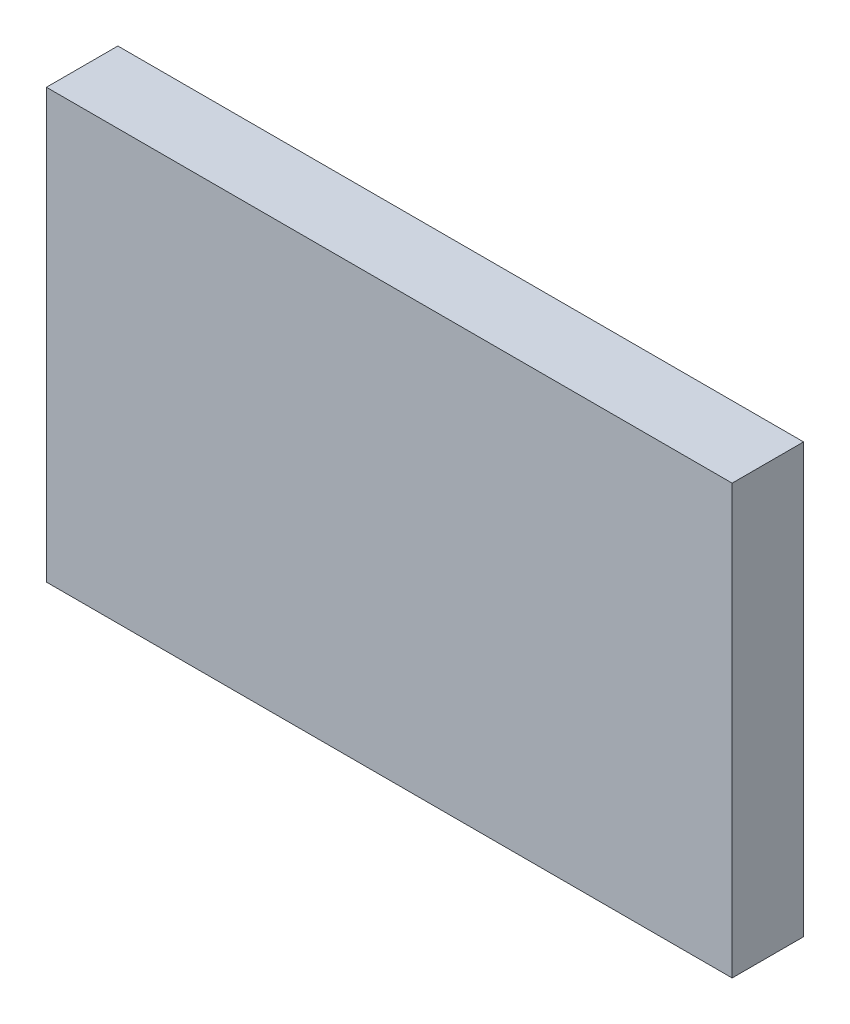
ISO-10303-21;
HEADER;
FILE_DESCRIPTION(('STEP AP214'),'2;1');
FILE_NAME('part.step','',(''),(''),'','','');
FILE_SCHEMA(('AUTOMOTIVE_DESIGN { 1 0 10303 214 1 1 1 1 }'));
ENDSEC;
DATA;
#1=APPLICATION_CONTEXT('core data for automotive mechanical design processes');
#2=APPLICATION_PROTOCOL_DEFINITION('international standard','automotive_design',2000,#1);
#3=PRODUCT_CONTEXT('',#1,'mechanical');
#4=PRODUCT('Part','Part','',(#3));
#5=PRODUCT_RELATED_PRODUCT_CATEGORY('part','',(#4));
#6=PRODUCT_DEFINITION_FORMATION('','',#4);
#7=PRODUCT_DEFINITION_CONTEXT('part definition',#1,'design');
#8=PRODUCT_DEFINITION('design','',#6,#7);
#9=PRODUCT_DEFINITION_SHAPE('','',#8);
#10=(LENGTH_UNIT() NAMED_UNIT(*) SI_UNIT(.MILLI.,.METRE.));
#11=(NAMED_UNIT(*) PLANE_ANGLE_UNIT() SI_UNIT($,.RADIAN.));
#12=(NAMED_UNIT(*) SI_UNIT($,.STERADIAN.) SOLID_ANGLE_UNIT());
#13=UNCERTAINTY_MEASURE_WITH_UNIT(LENGTH_MEASURE(1.E-05),#10,'distance_accuracy_value','');
#14=(GEOMETRIC_REPRESENTATION_CONTEXT(3) GLOBAL_UNCERTAINTY_ASSIGNED_CONTEXT((#13)) GLOBAL_UNIT_ASSIGNED_CONTEXT((#10,
#11,#12)) REPRESENTATION_CONTEXT('',''));
#15=CARTESIAN_POINT('',(0.,0.,0.));
#16=DIRECTION('',(0.,0.,1.));
#17=DIRECTION('',(1.,0.,0.));
#18=AXIS2_PLACEMENT_3D('',#15,#16,#17);
#19=CARTESIAN_POINT('',(24.,15.,5.));
#20=DIRECTION('',(-1.,0.,0.));
#21=DIRECTION('',(0.,-1.,0.));
#22=AXIS2_PLACEMENT_3D('',#19,#20,#21);
#23=PLANE('',#22);
#24=DIRECTION('',(0.,1.,0.));
#25=VECTOR('',#24,1.);
#26=CARTESIAN_POINT('',(24.,15.,0.));
#27=LINE('',#26,#25);
#28=CARTESIAN_POINT('',(24.,-15.,0.));
#29=VERTEX_POINT('',#28);
#30=CARTESIAN_POINT('',(24.,15.,0.));
#31=VERTEX_POINT('',#30);
#32=EDGE_CURVE('E95',#29,#31,#27,.T.);
#33=ORIENTED_EDGE('',*,*,#32,.T.);
#34=DIRECTION('',(0.,0.,-1.));
#35=VECTOR('',#34,1.);
#36=CARTESIAN_POINT('',(24.,15.,5.));
#37=LINE('',#36,#35);
#38=CARTESIAN_POINT('',(24.,15.,5.));
#39=VERTEX_POINT('',#38);
#40=EDGE_CURVE('E11',#39,#31,#37,.T.);
#41=ORIENTED_EDGE('',*,*,#40,.F.);
#42=DIRECTION('',(0.,1.,0.));
#43=VECTOR('',#42,1.);
#44=CARTESIAN_POINT('',(24.,15.,5.));
#45=LINE('',#44,#43);
#46=CARTESIAN_POINT('',(24.,-15.,5.));
#47=VERTEX_POINT('',#46);
#48=EDGE_CURVE('E83',#47,#39,#45,.T.);
#49=ORIENTED_EDGE('',*,*,#48,.F.);
#50=DIRECTION('',(0.,0.,-1.));
#51=VECTOR('',#50,1.);
#52=CARTESIAN_POINT('',(24.,-15.,5.));
#53=LINE('',#52,#51);
#54=EDGE_CURVE('E91',#47,#29,#53,.T.);
#55=ORIENTED_EDGE('',*,*,#54,.T.);
#56=EDGE_LOOP('',(#33,#41,#49,#55));
#57=FACE_BOUND('',#56,.T.);
#58=ADVANCED_FACE('F32',(#57),#23,.F.);
#59=CARTESIAN_POINT('',(-24.,15.,5.));
#60=DIRECTION('',(0.,-1.,0.));
#61=DIRECTION('',(0.,0.,-1.));
#62=AXIS2_PLACEMENT_3D('',#59,#60,#61);
#63=PLANE('',#62);
#64=DIRECTION('',(-1.,0.,0.));
#65=VECTOR('',#64,1.);
#66=CARTESIAN_POINT('',(-24.,15.,0.));
#67=LINE('',#66,#65);
#68=CARTESIAN_POINT('',(-24.,15.,0.));
#69=VERTEX_POINT('',#68);
#70=EDGE_CURVE('E87',#31,#69,#67,.T.);
#71=ORIENTED_EDGE('',*,*,#70,.T.);
#72=DIRECTION('',(0.,0.,-1.));
#73=VECTOR('',#72,1.);
#74=CARTESIAN_POINT('',(-24.,15.,5.));
#75=LINE('',#74,#73);
#76=CARTESIAN_POINT('',(-24.,15.,5.));
#77=VERTEX_POINT('',#76);
#78=EDGE_CURVE('E40',#77,#69,#75,.T.);
#79=ORIENTED_EDGE('',*,*,#78,.F.);
#80=DIRECTION('',(-1.,0.,0.));
#81=VECTOR('',#80,1.);
#82=CARTESIAN_POINT('',(-24.,15.,5.));
#83=LINE('',#82,#81);
#84=EDGE_CURVE('E78',#39,#77,#83,.T.);
#85=ORIENTED_EDGE('',*,*,#84,.F.);
#86=ORIENTED_EDGE('',*,*,#40,.T.);
#87=EDGE_LOOP('',(#71,#79,#85,#86));
#88=FACE_BOUND('',#87,.T.);
#89=ADVANCED_FACE('F86',(#88),#63,.F.);
#90=CARTESIAN_POINT('',(-24.,15.,5.));
#91=DIRECTION('',(1.,0.,0.));
#92=DIRECTION('',(0.,1.,0.));
#93=AXIS2_PLACEMENT_3D('',#90,#91,#92);
#94=PLANE('',#93);
#95=DIRECTION('',(0.,-1.,0.));
#96=VECTOR('',#95,1.);
#97=CARTESIAN_POINT('',(-24.,15.,0.));
#98=LINE('',#97,#96);
#99=CARTESIAN_POINT('',(-24.,-15.,0.));
#100=VERTEX_POINT('',#99);
#101=EDGE_CURVE('E65',#69,#100,#98,.T.);
#102=ORIENTED_EDGE('',*,*,#101,.T.);
#103=DIRECTION('',(0.,0.,-1.));
#104=VECTOR('',#103,1.);
#105=CARTESIAN_POINT('',(-24.,-15.,5.));
#106=LINE('',#105,#104);
#107=CARTESIAN_POINT('',(-24.,-15.,5.));
#108=VERTEX_POINT('',#107);
#109=EDGE_CURVE('E88',#108,#100,#106,.T.);
#110=ORIENTED_EDGE('',*,*,#109,.F.);
#111=DIRECTION('',(0.,-1.,0.));
#112=VECTOR('',#111,1.);
#113=CARTESIAN_POINT('',(-24.,15.,5.));
#114=LINE('',#113,#112);
#115=EDGE_CURVE('E81',#77,#108,#114,.T.);
#116=ORIENTED_EDGE('',*,*,#115,.F.);
#117=ORIENTED_EDGE('',*,*,#78,.T.);
#118=EDGE_LOOP('',(#102,#110,#116,#117));
#119=FACE_BOUND('',#118,.T.);
#120=ADVANCED_FACE('F89',(#119),#94,.F.);
#121=CARTESIAN_POINT('',(-24.,-15.,5.));
#122=DIRECTION('',(0.,1.,0.));
#123=DIRECTION('',(0.,0.,1.));
#124=AXIS2_PLACEMENT_3D('',#121,#122,#123);
#125=PLANE('',#124);
#126=DIRECTION('',(1.,0.,0.));
#127=VECTOR('',#126,1.);
#128=CARTESIAN_POINT('',(-24.,-15.,0.));
#129=LINE('',#128,#127);
#130=EDGE_CURVE('E71',#100,#29,#129,.T.);
#131=ORIENTED_EDGE('',*,*,#130,.T.);
#132=ORIENTED_EDGE('',*,*,#54,.F.);
#133=DIRECTION('',(1.,0.,0.));
#134=VECTOR('',#133,1.);
#135=CARTESIAN_POINT('',(-24.,-15.,5.));
#136=LINE('',#135,#134);
#137=EDGE_CURVE('E48',#108,#47,#136,.T.);
#138=ORIENTED_EDGE('',*,*,#137,.F.);
#139=ORIENTED_EDGE('',*,*,#109,.T.);
#140=EDGE_LOOP('',(#131,#132,#138,#139));
#141=FACE_BOUND('',#140,.T.);
#142=ADVANCED_FACE('F102',(#141),#125,.F.);
#143=CARTESIAN_POINT('',(0.,0.,5.));
#144=DIRECTION('',(0.,0.,1.));
#145=DIRECTION('',(1.,0.,0.));
#146=AXIS2_PLACEMENT_3D('',#143,#144,#145);
#147=PLANE('',#146);
#148=ORIENTED_EDGE('',*,*,#48,.T.);
#149=ORIENTED_EDGE('',*,*,#84,.T.);
#150=ORIENTED_EDGE('',*,*,#115,.T.);
#151=ORIENTED_EDGE('',*,*,#137,.T.);
#152=EDGE_LOOP('',(#148,#149,#150,#151));
#153=FACE_BOUND('',#152,.T.);
#154=ADVANCED_FACE('F79',(#153),#147,.T.);
#155=CARTESIAN_POINT('',(0.,0.,0.));
#156=DIRECTION('',(0.,0.,1.));
#157=DIRECTION('',(1.,0.,0.));
#158=AXIS2_PLACEMENT_3D('',#155,#156,#157);
#159=PLANE('',#158);
#160=ORIENTED_EDGE('',*,*,#32,.F.);
#161=ORIENTED_EDGE('',*,*,#130,.F.);
#162=ORIENTED_EDGE('',*,*,#101,.F.);
#163=ORIENTED_EDGE('',*,*,#70,.F.);
#164=EDGE_LOOP('',(#160,#161,#162,#163));
#165=FACE_BOUND('',#164,.T.);
#166=ADVANCED_FACE('F105',(#165),#159,.F.);
#167=CLOSED_SHELL('',(#58,#89,#120,#142,#154,#166));
#168=MANIFOLD_SOLID_BREP('B2',#167);
#169=ADVANCED_BREP_SHAPE_REPRESENTATION('',(#18,#168),#14);
#170=SHAPE_DEFINITION_REPRESENTATION(#9,#169);
ENDSEC;
END-ISO-10303-21;
